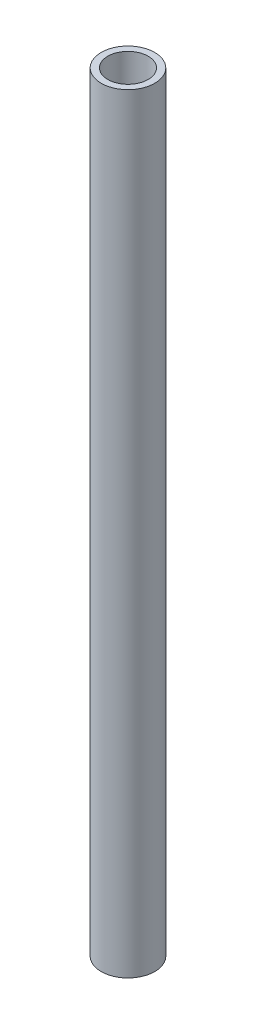
ISO-10303-21;
HEADER;
FILE_DESCRIPTION(('STEP AP214'),'2;1');
FILE_NAME('part.step','',(''),(''),'','','');
FILE_SCHEMA(('AUTOMOTIVE_DESIGN { 1 0 10303 214 1 1 1 1 }'));
ENDSEC;
DATA;
#1=APPLICATION_CONTEXT('core data for automotive mechanical design processes');
#2=APPLICATION_PROTOCOL_DEFINITION('international standard','automotive_design',2000,#1);
#3=PRODUCT_CONTEXT('',#1,'mechanical');
#4=PRODUCT('Part','Part','',(#3));
#5=PRODUCT_RELATED_PRODUCT_CATEGORY('part','',(#4));
#6=PRODUCT_DEFINITION_FORMATION('','',#4);
#7=PRODUCT_DEFINITION_CONTEXT('part definition',#1,'design');
#8=PRODUCT_DEFINITION('design','',#6,#7);
#9=PRODUCT_DEFINITION_SHAPE('','',#8);
#10=(LENGTH_UNIT() NAMED_UNIT(*) SI_UNIT(.MILLI.,.METRE.));
#11=(NAMED_UNIT(*) PLANE_ANGLE_UNIT() SI_UNIT($,.RADIAN.));
#12=(NAMED_UNIT(*) SI_UNIT($,.STERADIAN.) SOLID_ANGLE_UNIT());
#13=UNCERTAINTY_MEASURE_WITH_UNIT(LENGTH_MEASURE(1.E-05),#10,'distance_accuracy_value','');
#14=(GEOMETRIC_REPRESENTATION_CONTEXT(3) GLOBAL_UNCERTAINTY_ASSIGNED_CONTEXT((#13)) GLOBAL_UNIT_ASSIGNED_CONTEXT((#10,
#11,#12)) REPRESENTATION_CONTEXT('',''));
#15=CARTESIAN_POINT('',(0.,0.,0.));
#16=DIRECTION('',(0.,0.,1.));
#17=DIRECTION('',(1.,0.,0.));
#18=AXIS2_PLACEMENT_3D('',#15,#16,#17);
#19=CARTESIAN_POINT('',(0.,120.904,0.));
#20=DIRECTION('',(0.,1.,0.));
#21=DIRECTION('',(0.,0.,1.));
#22=AXIS2_PLACEMENT_3D('',#19,#20,#21);
#23=PLANE('',#22);
#24=CARTESIAN_POINT('',(0.,120.904,0.));
#25=DIRECTION('',(0.,1.,0.));
#26=DIRECTION('',(0.,0.,1.));
#27=AXIS2_PLACEMENT_3D('',#24,#25,#26);
#28=CIRCLE('',#27,4.2037);
#29=CARTESIAN_POINT('',(0.,120.904,4.2037));
#30=VERTEX_POINT('',#29);
#31=EDGE_CURVE('E10',#30,#30,#28,.T.);
#32=ORIENTED_EDGE('',*,*,#31,.T.);
#33=EDGE_LOOP('',(#32));
#34=FACE_BOUND('',#33,.T.);
#35=CARTESIAN_POINT('',(0.,120.904,0.));
#36=DIRECTION('',(0.,1.,0.));
#37=DIRECTION('',(0.,0.,1.));
#38=AXIS2_PLACEMENT_3D('',#35,#36,#37);
#39=CIRCLE('',#38,3.175);
#40=CARTESIAN_POINT('',(0.,120.904,3.175));
#41=VERTEX_POINT('',#40);
#42=EDGE_CURVE('E49',#41,#41,#39,.T.);
#43=ORIENTED_EDGE('',*,*,#42,.F.);
#44=EDGE_LOOP('',(#43));
#45=FACE_BOUND('',#44,.T.);
#46=ADVANCED_FACE('F38',(#34,#45),#23,.T.);
#47=CARTESIAN_POINT('',(0.,0.,0.));
#48=DIRECTION('',(0.,1.,0.));
#49=DIRECTION('',(0.,0.,1.));
#50=AXIS2_PLACEMENT_3D('',#47,#48,#49);
#51=PLANE('',#50);
#52=CARTESIAN_POINT('',(0.,0.,0.));
#53=DIRECTION('',(0.,1.,0.));
#54=DIRECTION('',(0.,0.,1.));
#55=AXIS2_PLACEMENT_3D('',#52,#53,#54);
#56=CIRCLE('',#55,4.2037);
#57=CARTESIAN_POINT('',(0.,0.,4.2037));
#58=VERTEX_POINT('',#57);
#59=EDGE_CURVE('E42',#58,#58,#56,.T.);
#60=ORIENTED_EDGE('',*,*,#59,.F.);
#61=EDGE_LOOP('',(#60));
#62=FACE_BOUND('',#61,.T.);
#63=CARTESIAN_POINT('',(0.,0.,0.));
#64=DIRECTION('',(0.,1.,0.));
#65=DIRECTION('',(0.,0.,1.));
#66=AXIS2_PLACEMENT_3D('',#63,#64,#65);
#67=CIRCLE('',#66,3.175);
#68=CARTESIAN_POINT('',(0.,0.,3.175));
#69=VERTEX_POINT('',#68);
#70=EDGE_CURVE('E51',#69,#69,#67,.T.);
#71=ORIENTED_EDGE('',*,*,#70,.T.);
#72=EDGE_LOOP('',(#71));
#73=FACE_BOUND('',#72,.T.);
#74=ADVANCED_FACE('F61',(#62,#73),#51,.F.);
#75=CARTESIAN_POINT('',(0.,120.904,0.));
#76=DIRECTION('',(0.,-1.,0.));
#77=DIRECTION('',(0.,0.,-1.));
#78=AXIS2_PLACEMENT_3D('',#75,#76,#77);
#79=CYLINDRICAL_SURFACE('',#78,4.2037);
#80=ORIENTED_EDGE('',*,*,#31,.F.);
#81=EDGE_LOOP('',(#80));
#82=FACE_BOUND('',#81,.T.);
#83=ORIENTED_EDGE('',*,*,#59,.T.);
#84=EDGE_LOOP('',(#83));
#85=FACE_BOUND('',#84,.T.);
#86=ADVANCED_FACE('F40',(#82,#85),#79,.T.);
#87=CARTESIAN_POINT('',(0.,120.904,0.));
#88=DIRECTION('',(0.,-1.,0.));
#89=DIRECTION('',(0.,0.,-1.));
#90=AXIS2_PLACEMENT_3D('',#87,#88,#89);
#91=CYLINDRICAL_SURFACE('',#90,3.175);
#92=ORIENTED_EDGE('',*,*,#42,.T.);
#93=EDGE_LOOP('',(#92));
#94=FACE_BOUND('',#93,.T.);
#95=ORIENTED_EDGE('',*,*,#70,.F.);
#96=EDGE_LOOP('',(#95));
#97=FACE_BOUND('',#96,.T.);
#98=ADVANCED_FACE('F57',(#94,#97),#91,.F.);
#99=CLOSED_SHELL('',(#46,#74,#86,#98));
#100=MANIFOLD_SOLID_BREP('B2',#99);
#101=ADVANCED_BREP_SHAPE_REPRESENTATION('',(#18,#100),#14);
#102=SHAPE_DEFINITION_REPRESENTATION(#9,#101);
ENDSEC;
END-ISO-10303-21;
